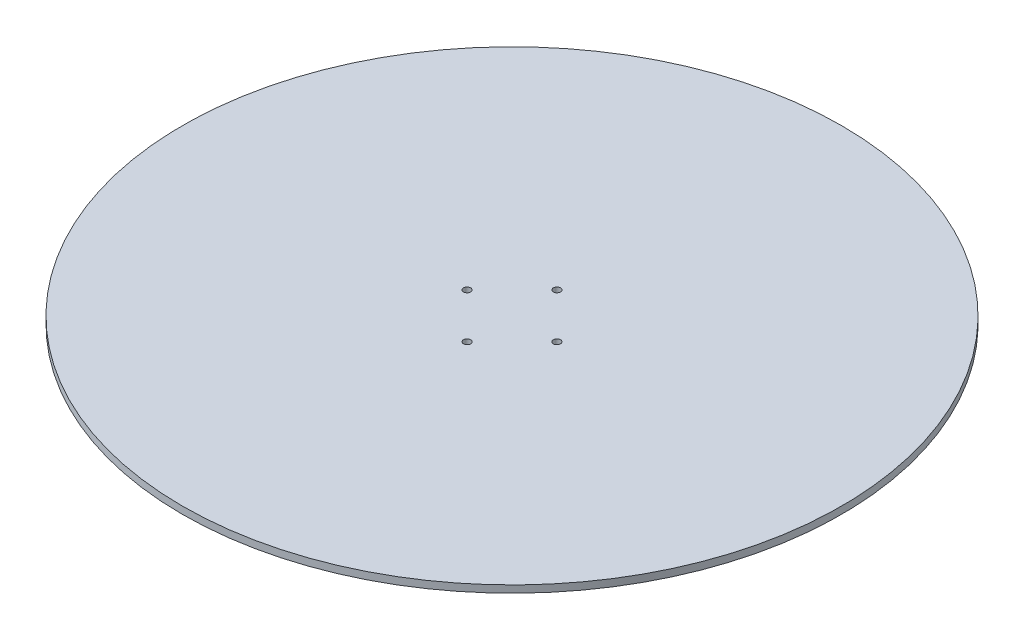
ISO-10303-21;
HEADER;
FILE_DESCRIPTION(('STEP AP214'),'2;1');
FILE_NAME('part.step','',(''),(''),'','','');
FILE_SCHEMA(('AUTOMOTIVE_DESIGN { 1 0 10303 214 1 1 1 1 }'));
ENDSEC;
DATA;
#1=APPLICATION_CONTEXT('core data for automotive mechanical design processes');
#2=APPLICATION_PROTOCOL_DEFINITION('international standard','automotive_design',2000,#1);
#3=PRODUCT_CONTEXT('',#1,'mechanical');
#4=PRODUCT('Part','Part','',(#3));
#5=PRODUCT_RELATED_PRODUCT_CATEGORY('part','',(#4));
#6=PRODUCT_DEFINITION_FORMATION('','',#4);
#7=PRODUCT_DEFINITION_CONTEXT('part definition',#1,'design');
#8=PRODUCT_DEFINITION('design','',#6,#7);
#9=PRODUCT_DEFINITION_SHAPE('','',#8);
#10=(LENGTH_UNIT() NAMED_UNIT(*) SI_UNIT(.MILLI.,.METRE.));
#11=(NAMED_UNIT(*) PLANE_ANGLE_UNIT() SI_UNIT($,.RADIAN.));
#12=(NAMED_UNIT(*) SI_UNIT($,.STERADIAN.) SOLID_ANGLE_UNIT());
#13=UNCERTAINTY_MEASURE_WITH_UNIT(LENGTH_MEASURE(1.E-05),#10,'distance_accuracy_value','');
#14=(GEOMETRIC_REPRESENTATION_CONTEXT(3) GLOBAL_UNCERTAINTY_ASSIGNED_CONTEXT((#13)) GLOBAL_UNIT_ASSIGNED_CONTEXT((#10,
#11,#12)) REPRESENTATION_CONTEXT('',''));
#15=CARTESIAN_POINT('',(0.,0.,0.));
#16=DIRECTION('',(0.,0.,1.));
#17=DIRECTION('',(1.,0.,0.));
#18=AXIS2_PLACEMENT_3D('',#15,#16,#17);
#19=CARTESIAN_POINT('',(0.,6.,0.));
#20=DIRECTION('',(0.,-1.,0.));
#21=DIRECTION('',(0.,0.,-1.));
#22=AXIS2_PLACEMENT_3D('',#19,#20,#21);
#23=CYLINDRICAL_SURFACE('',#22,275.);
#24=CARTESIAN_POINT('',(0.,6.,0.));
#25=DIRECTION('',(0.,1.,0.));
#26=DIRECTION('',(0.,0.,1.));
#27=AXIS2_PLACEMENT_3D('',#24,#25,#26);
#28=CIRCLE('',#27,275.);
#29=CARTESIAN_POINT('',(0.,6.,275.));
#30=VERTEX_POINT('',#29);
#31=EDGE_CURVE('E10',#30,#30,#28,.T.);
#32=ORIENTED_EDGE('',*,*,#31,.F.);
#33=EDGE_LOOP('',(#32));
#34=FACE_BOUND('',#33,.T.);
#35=CARTESIAN_POINT('',(0.,0.,0.));
#36=DIRECTION('',(0.,1.,0.));
#37=DIRECTION('',(0.,0.,1.));
#38=AXIS2_PLACEMENT_3D('',#35,#36,#37);
#39=CIRCLE('',#38,275.);
#40=CARTESIAN_POINT('',(0.,0.,275.));
#41=VERTEX_POINT('',#40);
#42=EDGE_CURVE('E34',#41,#41,#39,.T.);
#43=ORIENTED_EDGE('',*,*,#42,.T.);
#44=EDGE_LOOP('',(#43));
#45=FACE_BOUND('',#44,.T.);
#46=ADVANCED_FACE('F31',(#34,#45),#23,.T.);
#47=CARTESIAN_POINT('',(0.,6.,0.));
#48=DIRECTION('',(0.,1.,0.));
#49=DIRECTION('',(0.,0.,1.));
#50=AXIS2_PLACEMENT_3D('',#47,#48,#49);
#51=PLANE('',#50);
#52=CARTESIAN_POINT('',(0.,6.,-37.5));
#53=DIRECTION('',(0.,1.,0.));
#54=DIRECTION('',(0.,0.,1.));
#55=AXIS2_PLACEMENT_3D('',#52,#53,#54);
#56=CIRCLE('',#55,3.);
#57=CARTESIAN_POINT('',(0.,6.,-34.5));
#58=VERTEX_POINT('',#57);
#59=EDGE_CURVE('E63',#58,#58,#56,.T.);
#60=ORIENTED_EDGE('',*,*,#59,.F.);
#61=EDGE_LOOP('',(#60));
#62=FACE_BOUND('',#61,.T.);
#63=CARTESIAN_POINT('',(37.5,6.,0.));
#64=DIRECTION('',(0.,1.,0.));
#65=DIRECTION('',(0.,0.,1.));
#66=AXIS2_PLACEMENT_3D('',#63,#64,#65);
#67=CIRCLE('',#66,3.);
#68=CARTESIAN_POINT('',(37.5,6.,3.));
#69=VERTEX_POINT('',#68);
#70=EDGE_CURVE('E57',#69,#69,#67,.T.);
#71=ORIENTED_EDGE('',*,*,#70,.F.);
#72=EDGE_LOOP('',(#71));
#73=FACE_BOUND('',#72,.T.);
#74=CARTESIAN_POINT('',(0.,6.,37.5));
#75=DIRECTION('',(0.,1.,0.));
#76=DIRECTION('',(0.,0.,1.));
#77=AXIS2_PLACEMENT_3D('',#74,#75,#76);
#78=CIRCLE('',#77,3.);
#79=CARTESIAN_POINT('',(0.,6.,40.5));
#80=VERTEX_POINT('',#79);
#81=EDGE_CURVE('E51',#80,#80,#78,.T.);
#82=ORIENTED_EDGE('',*,*,#81,.F.);
#83=EDGE_LOOP('',(#82));
#84=FACE_BOUND('',#83,.T.);
#85=CARTESIAN_POINT('',(-37.5,6.,0.));
#86=DIRECTION('',(0.,1.,0.));
#87=DIRECTION('',(0.,0.,1.));
#88=AXIS2_PLACEMENT_3D('',#85,#86,#87);
#89=CIRCLE('',#88,3.);
#90=CARTESIAN_POINT('',(-37.5,6.,3.));
#91=VERTEX_POINT('',#90);
#92=EDGE_CURVE('E45',#91,#91,#89,.T.);
#93=ORIENTED_EDGE('',*,*,#92,.F.);
#94=EDGE_LOOP('',(#93));
#95=FACE_BOUND('',#94,.T.);
#96=ORIENTED_EDGE('',*,*,#31,.T.);
#97=EDGE_LOOP('',(#96));
#98=FACE_BOUND('',#97,.T.);
#99=ADVANCED_FACE('F69',(#62,#73,#84,#95,#98),#51,.T.);
#100=CARTESIAN_POINT('',(0.,0.,0.));
#101=DIRECTION('',(0.,1.,0.));
#102=DIRECTION('',(0.,0.,1.));
#103=AXIS2_PLACEMENT_3D('',#100,#101,#102);
#104=PLANE('',#103);
#105=CARTESIAN_POINT('',(0.,0.,-37.5));
#106=DIRECTION('',(0.,1.,0.));
#107=DIRECTION('',(0.,0.,1.));
#108=AXIS2_PLACEMENT_3D('',#105,#106,#107);
#109=CIRCLE('',#108,3.);
#110=CARTESIAN_POINT('',(0.,0.,-34.5));
#111=VERTEX_POINT('',#110);
#112=EDGE_CURVE('E60',#111,#111,#109,.T.);
#113=ORIENTED_EDGE('',*,*,#112,.T.);
#114=EDGE_LOOP('',(#113));
#115=FACE_BOUND('',#114,.T.);
#116=CARTESIAN_POINT('',(37.5,0.,0.));
#117=DIRECTION('',(0.,1.,0.));
#118=DIRECTION('',(0.,0.,1.));
#119=AXIS2_PLACEMENT_3D('',#116,#117,#118);
#120=CIRCLE('',#119,3.);
#121=CARTESIAN_POINT('',(37.5,0.,3.));
#122=VERTEX_POINT('',#121);
#123=EDGE_CURVE('E54',#122,#122,#120,.T.);
#124=ORIENTED_EDGE('',*,*,#123,.T.);
#125=EDGE_LOOP('',(#124));
#126=FACE_BOUND('',#125,.T.);
#127=CARTESIAN_POINT('',(0.,0.,37.5));
#128=DIRECTION('',(0.,1.,0.));
#129=DIRECTION('',(0.,0.,1.));
#130=AXIS2_PLACEMENT_3D('',#127,#128,#129);
#131=CIRCLE('',#130,3.);
#132=CARTESIAN_POINT('',(0.,0.,40.5));
#133=VERTEX_POINT('',#132);
#134=EDGE_CURVE('E48',#133,#133,#131,.T.);
#135=ORIENTED_EDGE('',*,*,#134,.T.);
#136=EDGE_LOOP('',(#135));
#137=FACE_BOUND('',#136,.T.);
#138=CARTESIAN_POINT('',(-37.5,0.,0.));
#139=DIRECTION('',(0.,1.,0.));
#140=DIRECTION('',(0.,0.,1.));
#141=AXIS2_PLACEMENT_3D('',#138,#139,#140);
#142=CIRCLE('',#141,3.);
#143=CARTESIAN_POINT('',(-37.5,0.,3.));
#144=VERTEX_POINT('',#143);
#145=EDGE_CURVE('E41',#144,#144,#142,.T.);
#146=ORIENTED_EDGE('',*,*,#145,.T.);
#147=EDGE_LOOP('',(#146));
#148=FACE_BOUND('',#147,.T.);
#149=ORIENTED_EDGE('',*,*,#42,.F.);
#150=EDGE_LOOP('',(#149));
#151=FACE_BOUND('',#150,.T.);
#152=ADVANCED_FACE('F72',(#115,#126,#137,#148,#151),#104,.F.);
#153=CARTESIAN_POINT('',(-37.5,6.,0.));
#154=DIRECTION('',(0.,1.,0.));
#155=DIRECTION('',(0.,0.,1.));
#156=AXIS2_PLACEMENT_3D('',#153,#154,#155);
#157=CYLINDRICAL_SURFACE('',#156,3.);
#158=ORIENTED_EDGE('',*,*,#145,.F.);
#159=EDGE_LOOP('',(#158));
#160=FACE_BOUND('',#159,.T.);
#161=ORIENTED_EDGE('',*,*,#92,.T.);
#162=EDGE_LOOP('',(#161));
#163=FACE_BOUND('',#162,.T.);
#164=ADVANCED_FACE('F80',(#160,#163),#157,.F.);
#165=CARTESIAN_POINT('',(0.,6.,37.5));
#166=DIRECTION('',(0.,1.,0.));
#167=DIRECTION('',(0.,0.,1.));
#168=AXIS2_PLACEMENT_3D('',#165,#166,#167);
#169=CYLINDRICAL_SURFACE('',#168,3.);
#170=ORIENTED_EDGE('',*,*,#134,.F.);
#171=EDGE_LOOP('',(#170));
#172=FACE_BOUND('',#171,.T.);
#173=ORIENTED_EDGE('',*,*,#81,.T.);
#174=EDGE_LOOP('',(#173));
#175=FACE_BOUND('',#174,.T.);
#176=ADVANCED_FACE('F82',(#172,#175),#169,.F.);
#177=CARTESIAN_POINT('',(37.5,6.,0.));
#178=DIRECTION('',(0.,1.,0.));
#179=DIRECTION('',(0.,0.,1.));
#180=AXIS2_PLACEMENT_3D('',#177,#178,#179);
#181=CYLINDRICAL_SURFACE('',#180,3.);
#182=ORIENTED_EDGE('',*,*,#123,.F.);
#183=EDGE_LOOP('',(#182));
#184=FACE_BOUND('',#183,.T.);
#185=ORIENTED_EDGE('',*,*,#70,.T.);
#186=EDGE_LOOP('',(#185));
#187=FACE_BOUND('',#186,.T.);
#188=ADVANCED_FACE('F89',(#184,#187),#181,.F.);
#189=CARTESIAN_POINT('',(0.,6.,-37.5));
#190=DIRECTION('',(0.,1.,0.));
#191=DIRECTION('',(0.,0.,1.));
#192=AXIS2_PLACEMENT_3D('',#189,#190,#191);
#193=CYLINDRICAL_SURFACE('',#192,3.);
#194=ORIENTED_EDGE('',*,*,#112,.F.);
#195=EDGE_LOOP('',(#194));
#196=FACE_BOUND('',#195,.T.);
#197=ORIENTED_EDGE('',*,*,#59,.T.);
#198=EDGE_LOOP('',(#197));
#199=FACE_BOUND('',#198,.T.);
#200=ADVANCED_FACE('F67',(#196,#199),#193,.F.);
#201=CLOSED_SHELL('',(#46,#99,#152,#164,#176,#188,#200));
#202=MANIFOLD_SOLID_BREP('B2',#201);
#203=ADVANCED_BREP_SHAPE_REPRESENTATION('',(#18,#202),#14);
#204=SHAPE_DEFINITION_REPRESENTATION(#9,#203);
ENDSEC;
END-ISO-10303-21;
